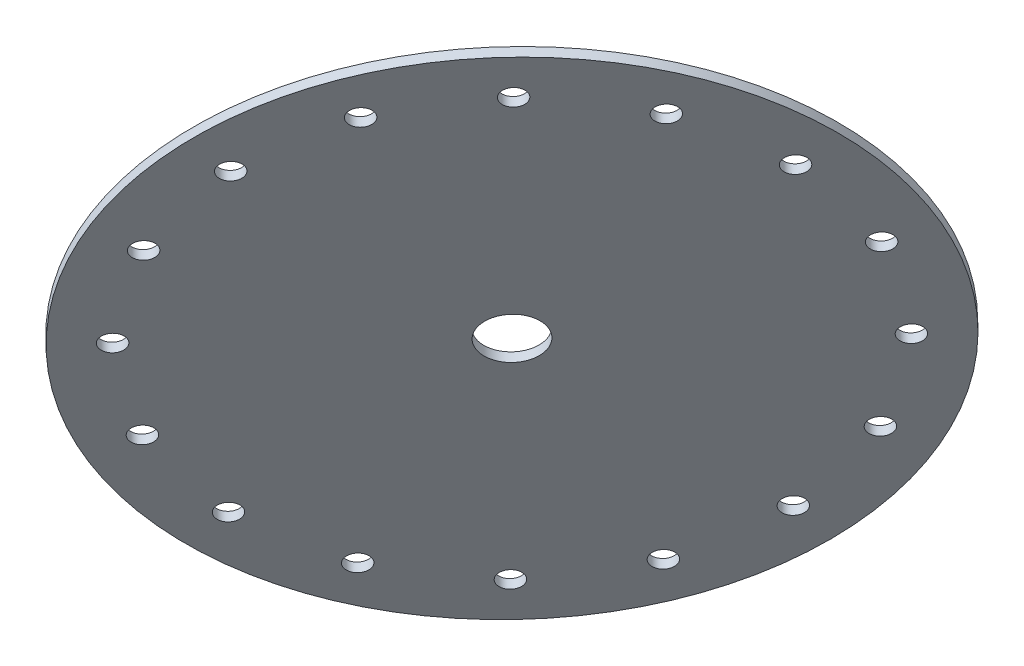
ISO-10303-21;
HEADER;
FILE_DESCRIPTION(('STEP AP214'),'2;1');
FILE_NAME('part.step','',(''),(''),'','','');
FILE_SCHEMA(('AUTOMOTIVE_DESIGN { 1 0 10303 214 1 1 1 1 }'));
ENDSEC;
DATA;
#1=APPLICATION_CONTEXT('core data for automotive mechanical design processes');
#2=APPLICATION_PROTOCOL_DEFINITION('international standard','automotive_design',2000,#1);
#3=PRODUCT_CONTEXT('',#1,'mechanical');
#4=PRODUCT('Part','Part','',(#3));
#5=PRODUCT_RELATED_PRODUCT_CATEGORY('part','',(#4));
#6=PRODUCT_DEFINITION_FORMATION('','',#4);
#7=PRODUCT_DEFINITION_CONTEXT('part definition',#1,'design');
#8=PRODUCT_DEFINITION('design','',#6,#7);
#9=PRODUCT_DEFINITION_SHAPE('','',#8);
#10=(LENGTH_UNIT() NAMED_UNIT(*) SI_UNIT(.MILLI.,.METRE.));
#11=(NAMED_UNIT(*) PLANE_ANGLE_UNIT() SI_UNIT($,.RADIAN.));
#12=(NAMED_UNIT(*) SI_UNIT($,.STERADIAN.) SOLID_ANGLE_UNIT());
#13=UNCERTAINTY_MEASURE_WITH_UNIT(LENGTH_MEASURE(1.E-05),#10,'distance_accuracy_value','');
#14=(GEOMETRIC_REPRESENTATION_CONTEXT(3) GLOBAL_UNCERTAINTY_ASSIGNED_CONTEXT((#13)) GLOBAL_UNIT_ASSIGNED_CONTEXT((#10,
#11,#12)) REPRESENTATION_CONTEXT('',''));
#15=CARTESIAN_POINT('',(0.,0.,0.));
#16=DIRECTION('',(0.,0.,1.));
#17=DIRECTION('',(1.,0.,0.));
#18=AXIS2_PLACEMENT_3D('',#15,#16,#17);
#19=CARTESIAN_POINT('',(-287.529683175413,126.833377096205,-277.095107799131));
#20=DIRECTION('',(0.686266038589698,-0.302721577471584,0.661361150062143));
#21=DIRECTION('',(0.693920573141432,0.,-0.720051552439869));
#22=AXIS2_PLACEMENT_3D('',#19,#20,#21);
#23=PLANE('',#22);
#24=CARTESIAN_POINT('',(-320.056405661196,-16.1282885565635,-308.78066410037));
#25=DIRECTION('',(0.686266038589698,-0.302721577471584,0.661361150062143));
#26=DIRECTION('',(0.693920573141432,0.,-0.720051552439869));
#27=AXIS2_PLACEMENT_3D('',#24,#25,#26);
#28=CIRCLE('',#27,6.09999999999997);
#29=CARTESIAN_POINT('',(-315.823490165033,-16.1282885565635,-313.172978570253));
#30=VERTEX_POINT('',#29);
#31=EDGE_CURVE('E131',#30,#30,#28,.T.);
#32=ORIENTED_EDGE('',*,*,#31,.F.);
#33=EDGE_LOOP('',(#32));
#34=FACE_BOUND('',#33,.T.);
#35=CARTESIAN_POINT('',(-236.890605304079,25.9088358261778,-375.836794850627));
#36=DIRECTION('',(0.686266038589698,-0.302721577471584,0.661361150062143));
#37=DIRECTION('',(0.693920573141432,0.,-0.720051552439869));
#38=AXIS2_PLACEMENT_3D('',#35,#36,#37);
#39=CIRCLE('',#38,6.09999999999995);
#40=CARTESIAN_POINT('',(-232.657689807916,25.9088358261778,-380.22910932051));
#41=VERTEX_POINT('',#40);
#42=EDGE_CURVE('E119',#41,#41,#39,.T.);
#43=ORIENTED_EDGE('',*,*,#42,.F.);
#44=EDGE_LOOP('',(#43));
#45=FACE_BOUND('',#44,.T.);
#46=CARTESIAN_POINT('',(-183.388489977923,127.066187708618,-385.051384497717));
#47=DIRECTION('',(0.686266038589698,-0.302721577471584,0.661361150062143));
#48=DIRECTION('',(0.693920573141432,0.,-0.720051552439869));
#49=AXIS2_PLACEMENT_3D('',#46,#47,#48);
#50=CIRCLE('',#49,6.09999999999999);
#51=CARTESIAN_POINT('',(-179.15557448176,127.066187708618,-389.4436989676));
#52=VERTEX_POINT('',#51);
#53=EDGE_CURVE('E107',#52,#52,#50,.T.);
#54=ORIENTED_EDGE('',*,*,#53,.F.);
#55=EDGE_LOOP('',(#54));
#56=FACE_BOUND('',#55,.T.);
#57=CARTESIAN_POINT('',(-190.890873225139,228.08716229177,-331.026651398078));
#58=DIRECTION('',(0.686266038589698,-0.302721577471584,0.661361150062143));
#59=DIRECTION('',(0.693920573141432,0.,-0.720051552439869));
#60=AXIS2_PLACEMENT_3D('',#57,#58,#59);
#61=CIRCLE('',#60,6.09999999999999);
#62=CARTESIAN_POINT('',(-186.657957728977,228.08716229177,-335.418965867961));
#63=VERTEX_POINT('',#62);
#64=EDGE_CURVE('E95',#63,#63,#61,.T.);
#65=ORIENTED_EDGE('',*,*,#64,.F.);
#66=EDGE_LOOP('',(#65));
#67=FACE_BOUND('',#66,.T.);
#68=CARTESIAN_POINT('',(-255.00296068963,269.795042748973,-245.409551497891));
#69=DIRECTION('',(0.686266038589698,-0.302721577471584,0.661361150062143));
#70=DIRECTION('',(0.693920573141432,0.,-0.720051552439869));
#71=AXIS2_PLACEMENT_3D('',#68,#69,#70);
#72=CIRCLE('',#71,6.09999999999997);
#73=CARTESIAN_POINT('',(-250.770045193467,269.795042748973,-249.801865967774));
#74=VERTEX_POINT('',#73);
#75=EDGE_CURVE('E83',#74,#74,#72,.T.);
#76=ORIENTED_EDGE('',*,*,#75,.F.);
#77=EDGE_LOOP('',(#76));
#78=FACE_BOUND('',#77,.T.);
#79=CARTESIAN_POINT('',(-338.168761046747,227.757918366231,-178.353420747634));
#80=DIRECTION('',(0.686266038589698,-0.302721577471584,0.661361150062143));
#81=DIRECTION('',(0.693920573141432,0.,-0.720051552439869));
#82=AXIS2_PLACEMENT_3D('',#79,#80,#81);
#83=CIRCLE('',#82,6.09999999999999);
#84=CARTESIAN_POINT('',(-333.935845550584,227.757918366231,-182.745735217517));
#85=VERTEX_POINT('',#84);
#86=EDGE_CURVE('E71',#85,#85,#83,.T.);
#87=ORIENTED_EDGE('',*,*,#86,.F.);
#88=EDGE_LOOP('',(#87));
#89=FACE_BOUND('',#88,.T.);
#90=CARTESIAN_POINT('',(-391.670876372903,126.600566483792,-169.138831100544));
#91=DIRECTION('',(0.686266038589698,-0.302721577471584,0.661361150062143));
#92=DIRECTION('',(0.693920573141432,0.,-0.720051552439869));
#93=AXIS2_PLACEMENT_3D('',#90,#91,#92);
#94=CIRCLE('',#93,6.09999999999997);
#95=CARTESIAN_POINT('',(-387.43796087674,126.600566483792,-173.531145570427));
#96=VERTEX_POINT('',#95);
#97=EDGE_CURVE('E59',#96,#96,#94,.T.);
#98=ORIENTED_EDGE('',*,*,#97,.F.);
#99=EDGE_LOOP('',(#98));
#100=FACE_BOUND('',#99,.T.);
#101=CARTESIAN_POINT('',(-384.168493125686,25.5795919006389,-223.163564200183));
#102=DIRECTION('',(0.686266038589698,-0.302721577471584,0.661361150062143));
#103=DIRECTION('',(0.693920573141432,0.,-0.720051552439869));
#104=AXIS2_PLACEMENT_3D('',#101,#102,#103);
#105=CIRCLE('',#104,6.09999999999997);
#106=CARTESIAN_POINT('',(-379.935577629524,25.5795919006389,-227.555878670066));
#107=VERTEX_POINT('',#106);
#108=EDGE_CURVE('E47',#107,#107,#105,.T.);
#109=ORIENTED_EDGE('',*,*,#108,.F.);
#110=EDGE_LOOP('',(#109));
#111=FACE_BOUND('',#110,.T.);
#112=CARTESIAN_POINT('',(-287.529683175413,126.833377096205,-277.095107799131));
#113=DIRECTION('',(0.686266038589698,-0.302721577471584,0.661361150062143));
#114=DIRECTION('',(0.693920573141432,0.,-0.720051552439869));
#115=AXIS2_PLACEMENT_3D('',#112,#113,#114);
#116=CIRCLE('',#115,175.);
#117=CARTESIAN_POINT('',(-166.093582875662,126.833377096205,-403.104129476108));
#118=VERTEX_POINT('',#117);
#119=EDGE_CURVE('E10',#118,#118,#116,.T.);
#120=ORIENTED_EDGE('',*,*,#119,.T.);
#121=EDGE_LOOP('',(#120));
#122=FACE_BOUND('',#121,.T.);
#123=CARTESIAN_POINT('',(-287.529683175413,126.833377096205,-277.095107799131));
#124=DIRECTION('',(0.686266038589698,-0.302721577471584,0.661361150062143));
#125=DIRECTION('',(0.693920573141432,0.,-0.720051552439869));
#126=AXIS2_PLACEMENT_3D('',#123,#124,#125);
#127=CIRCLE('',#126,15.);
#128=CARTESIAN_POINT('',(-277.120874578291,126.833377096205,-287.895881085728));
#129=VERTEX_POINT('',#128);
#130=EDGE_CURVE('E42',#129,#129,#127,.T.);
#131=ORIENTED_EDGE('',*,*,#130,.F.);
#132=EDGE_LOOP('',(#131));
#133=FACE_BOUND('',#132,.T.);
#134=CARTESIAN_POINT('',(-396.191037866324,71.9092272278131,-189.482050792937));
#135=DIRECTION('',(0.686266038589698,-0.302721577471584,0.661361150062143));
#136=DIRECTION('',(0.693920573141432,0.,-0.720051552439869));
#137=AXIS2_PLACEMENT_3D('',#134,#135,#136);
#138=CIRCLE('',#137,6.09999999999997);
#139=CARTESIAN_POINT('',(-391.958122370161,71.9092272278131,-193.87436526282));
#140=VERTEX_POINT('',#139);
#141=EDGE_CURVE('E53',#140,#140,#138,.T.);
#142=ORIENTED_EDGE('',*,*,#141,.F.);
#143=EDGE_LOOP('',(#142));
#144=FACE_BOUND('',#143,.T.);
#145=CARTESIAN_POINT('',(-371.296162257431,181.327349045076,-165.230975909426));
#146=DIRECTION('',(0.686266038589698,-0.302721577471584,0.661361150062143));
#147=DIRECTION('',(0.693920573141432,0.,-0.720051552439869));
#148=AXIS2_PLACEMENT_3D('',#145,#146,#147);
#149=CIRCLE('',#148,6.10000000000001);
#150=CARTESIAN_POINT('',(-367.063246761269,181.327349045076,-169.623290379309));
#151=VERTEX_POINT('',#150);
#152=EDGE_CURVE('E65',#151,#151,#149,.T.);
#153=ORIENTED_EDGE('',*,*,#152,.F.);
#154=EDGE_LOOP('',(#153));
#155=FACE_BOUND('',#154,.T.);
#156=CARTESIAN_POINT('',(-297.332019274535,258.82364116227,-206.508392343811));
#157=DIRECTION('',(0.686266038589698,-0.302721577471584,0.661361150062143));
#158=DIRECTION('',(0.693920573141432,0.,-0.720051552439869));
#159=AXIS2_PLACEMENT_3D('',#156,#157,#158);
#160=CIRCLE('',#159,6.09999999999997);
#161=CARTESIAN_POINT('',(-293.099103778372,258.82364116227,-210.900706813694));
#162=VERTEX_POINT('',#161);
#163=EDGE_CURVE('E77',#162,#162,#160,.T.);
#164=ORIENTED_EDGE('',*,*,#163,.F.);
#165=EDGE_LOOP('',(#164));
#166=FACE_BOUND('',#165,.T.);
#167=CARTESIAN_POINT('',(-217.625800747712,259.001826690768,-289.134549368552));
#168=DIRECTION('',(0.686266038589698,-0.302721577471584,0.661361150062143));
#169=DIRECTION('',(0.693920573141432,0.,-0.720051552439869));
#170=AXIS2_PLACEMENT_3D('',#167,#168,#169);
#171=CIRCLE('',#170,6.09999999999999);
#172=CARTESIAN_POINT('',(-213.392885251549,259.001826690768,-293.526863838435));
#173=VERTEX_POINT('',#172);
#174=EDGE_CURVE('E89',#173,#173,#171,.T.);
#175=ORIENTED_EDGE('',*,*,#174,.F.);
#176=EDGE_LOOP('',(#175));
#177=FACE_BOUND('',#176,.T.);
#178=CARTESIAN_POINT('',(-178.868328484502,181.757526964596,-364.708164805324));
#179=DIRECTION('',(0.686266038589698,-0.302721577471584,0.661361150062143));
#180=DIRECTION('',(0.693920573141432,0.,-0.720051552439869));
#181=AXIS2_PLACEMENT_3D('',#178,#179,#180);
#182=CIRCLE('',#181,6.09999999999997);
#183=CARTESIAN_POINT('',(-174.635412988339,181.757526964596,-369.100479275207));
#184=VERTEX_POINT('',#183);
#185=EDGE_CURVE('E101',#184,#184,#182,.T.);
#186=ORIENTED_EDGE('',*,*,#185,.F.);
#187=EDGE_LOOP('',(#186));
#188=FACE_BOUND('',#187,.T.);
#189=CARTESIAN_POINT('',(-203.763204093394,72.3394051473329,-388.959239688835));
#190=DIRECTION('',(0.686266038589698,-0.302721577471584,0.661361150062143));
#191=DIRECTION('',(0.693920573141432,0.,-0.720051552439869));
#192=AXIS2_PLACEMENT_3D('',#189,#190,#191);
#193=CIRCLE('',#192,6.09999999999999);
#194=CARTESIAN_POINT('',(-199.530288597231,72.3394051473329,-393.351554158719));
#195=VERTEX_POINT('',#194);
#196=EDGE_CURVE('E113',#195,#195,#193,.T.);
#197=ORIENTED_EDGE('',*,*,#196,.F.);
#198=EDGE_LOOP('',(#197));
#199=FACE_BOUND('',#198,.T.);
#200=CARTESIAN_POINT('',(-277.727347076291,-5.15688696986042,-347.68182325445));
#201=DIRECTION('',(0.686266038589698,-0.302721577471584,0.661361150062143));
#202=DIRECTION('',(0.693920573141432,0.,-0.720051552439869));
#203=AXIS2_PLACEMENT_3D('',#200,#201,#202);
#204=CIRCLE('',#203,6.09999999999997);
#205=CARTESIAN_POINT('',(-273.494431580128,-5.15688696986042,-352.074137724333));
#206=VERTEX_POINT('',#205);
#207=EDGE_CURVE('E125',#206,#206,#204,.T.);
#208=ORIENTED_EDGE('',*,*,#207,.F.);
#209=EDGE_LOOP('',(#208));
#210=FACE_BOUND('',#209,.T.);
#211=CARTESIAN_POINT('',(-357.433565603114,-5.33507249835891,-265.055666229709));
#212=DIRECTION('',(0.686266038589698,-0.302721577471584,0.661361150062143));
#213=DIRECTION('',(0.693920573141432,0.,-0.720051552439869));
#214=AXIS2_PLACEMENT_3D('',#211,#212,#213);
#215=CIRCLE('',#214,6.10000000000001);
#216=CARTESIAN_POINT('',(-353.200650106951,-5.33507249835891,-269.447980699592));
#217=VERTEX_POINT('',#216);
#218=EDGE_CURVE('E137',#217,#217,#215,.T.);
#219=ORIENTED_EDGE('',*,*,#218,.F.);
#220=EDGE_LOOP('',(#219));
#221=FACE_BOUND('',#220,.T.);
#222=ADVANCED_FACE('F31',(#34,#45,#56,#67,#78,#89,#100,#111,#122,#133,#144,#155,#166,#177,#188,
#199,#210,#221),#23,.T.);
#223=CARTESIAN_POINT('',(-290.961013368361,128.346984983563,-280.401913549441));
#224=DIRECTION('',(0.686266038589698,-0.302721577471584,0.661361150062143));
#225=DIRECTION('',(0.693920573141432,0.,-0.720051552439869));
#226=AXIS2_PLACEMENT_3D('',#223,#224,#225);
#227=PLANE('',#226);
#228=CARTESIAN_POINT('',(-290.961013368361,128.346984983563,-280.401913549441));
#229=DIRECTION('',(0.686266038589698,-0.302721577471584,0.661361150062143));
#230=DIRECTION('',(0.693920573141432,0.,-0.720051552439869));
#231=AXIS2_PLACEMENT_3D('',#228,#229,#230);
#232=CIRCLE('',#231,175.);
#233=CARTESIAN_POINT('',(-169.524913068611,128.346984983563,-406.410935226418));
#234=VERTEX_POINT('',#233);
#235=EDGE_CURVE('E35',#234,#234,#232,.T.);
#236=ORIENTED_EDGE('',*,*,#235,.F.);
#237=EDGE_LOOP('',(#236));
#238=FACE_BOUND('',#237,.T.);
#239=CARTESIAN_POINT('',(-290.961013368361,128.346984983563,-280.401913549441));
#240=DIRECTION('',(0.686266038589698,-0.302721577471584,0.661361150062143));
#241=DIRECTION('',(0.693920573141432,0.,-0.720051552439869));
#242=AXIS2_PLACEMENT_3D('',#239,#240,#241);
#243=CIRCLE('',#242,15.);
#244=CARTESIAN_POINT('',(-280.55220477124,128.346984983563,-291.202686836039));
#245=VERTEX_POINT('',#244);
#246=EDGE_CURVE('E44',#245,#245,#243,.T.);
#247=ORIENTED_EDGE('',*,*,#246,.T.);
#248=EDGE_LOOP('',(#247));
#249=FACE_BOUND('',#248,.T.);
#250=CARTESIAN_POINT('',(-387.599823318635,27.0931997879968,-226.470369950494));
#251=DIRECTION('',(0.686266038589698,-0.302721577471584,0.661361150062143));
#252=DIRECTION('',(0.693920573141432,0.,-0.720051552439869));
#253=AXIS2_PLACEMENT_3D('',#250,#251,#252);
#254=CIRCLE('',#253,6.09999999999997);
#255=CARTESIAN_POINT('',(-383.366907822472,27.0931997879968,-230.862684420377));
#256=VERTEX_POINT('',#255);
#257=EDGE_CURVE('E50',#256,#256,#254,.T.);
#258=ORIENTED_EDGE('',*,*,#257,.T.);
#259=EDGE_LOOP('',(#258));
#260=FACE_BOUND('',#259,.T.);
#261=CARTESIAN_POINT('',(-399.622368059272,73.4228351151711,-192.788856543248));
#262=DIRECTION('',(0.686266038589698,-0.302721577471584,0.661361150062143));
#263=DIRECTION('',(0.693920573141432,0.,-0.720051552439869));
#264=AXIS2_PLACEMENT_3D('',#261,#262,#263);
#265=CIRCLE('',#264,6.09999999999997);
#266=CARTESIAN_POINT('',(-395.389452563109,73.4228351151711,-197.181171013131));
#267=VERTEX_POINT('',#266);
#268=EDGE_CURVE('E56',#267,#267,#265,.T.);
#269=ORIENTED_EDGE('',*,*,#268,.T.);
#270=EDGE_LOOP('',(#269));
#271=FACE_BOUND('',#270,.T.);
#272=CARTESIAN_POINT('',(-395.102206565851,128.11417437115,-172.445636850855));
#273=DIRECTION('',(0.686266038589698,-0.302721577471584,0.661361150062143));
#274=DIRECTION('',(0.693920573141432,0.,-0.720051552439869));
#275=AXIS2_PLACEMENT_3D('',#272,#273,#274);
#276=CIRCLE('',#275,6.09999999999997);
#277=CARTESIAN_POINT('',(-390.869291069689,128.11417437115,-176.837951320738));
#278=VERTEX_POINT('',#277);
#279=EDGE_CURVE('E62',#278,#278,#276,.T.);
#280=ORIENTED_EDGE('',*,*,#279,.T.);
#281=EDGE_LOOP('',(#280));
#282=FACE_BOUND('',#281,.T.);
#283=CARTESIAN_POINT('',(-374.72749245038,182.840956932434,-168.537781659736));
#284=DIRECTION('',(0.686266038589698,-0.302721577471584,0.661361150062143));
#285=DIRECTION('',(0.693920573141432,0.,-0.720051552439869));
#286=AXIS2_PLACEMENT_3D('',#283,#284,#285);
#287=CIRCLE('',#286,6.10000000000001);
#288=CARTESIAN_POINT('',(-370.494576954217,182.840956932434,-172.93009612962));
#289=VERTEX_POINT('',#288);
#290=EDGE_CURVE('E68',#289,#289,#287,.T.);
#291=ORIENTED_EDGE('',*,*,#290,.T.);
#292=EDGE_LOOP('',(#291));
#293=FACE_BOUND('',#292,.T.);
#294=CARTESIAN_POINT('',(-341.600091239695,229.271526253589,-181.660226497945));
#295=DIRECTION('',(0.686266038589698,-0.302721577471584,0.661361150062143));
#296=DIRECTION('',(0.693920573141432,0.,-0.720051552439869));
#297=AXIS2_PLACEMENT_3D('',#294,#295,#296);
#298=CIRCLE('',#297,6.09999999999999);
#299=CARTESIAN_POINT('',(-337.367175743532,229.271526253589,-186.052540967828));
#300=VERTEX_POINT('',#299);
#301=EDGE_CURVE('E74',#300,#300,#298,.T.);
#302=ORIENTED_EDGE('',*,*,#301,.T.);
#303=EDGE_LOOP('',(#302));
#304=FACE_BOUND('',#303,.T.);
#305=CARTESIAN_POINT('',(-300.763349467483,260.337249049628,-209.815198094122));
#306=DIRECTION('',(0.686266038589698,-0.302721577471584,0.661361150062143));
#307=DIRECTION('',(0.693920573141432,0.,-0.720051552439869));
#308=AXIS2_PLACEMENT_3D('',#305,#306,#307);
#309=CIRCLE('',#308,6.09999999999997);
#310=CARTESIAN_POINT('',(-296.530433971321,260.337249049628,-214.207512564005));
#311=VERTEX_POINT('',#310);
#312=EDGE_CURVE('E80',#311,#311,#309,.T.);
#313=ORIENTED_EDGE('',*,*,#312,.T.);
#314=EDGE_LOOP('',(#313));
#315=FACE_BOUND('',#314,.T.);
#316=CARTESIAN_POINT('',(-258.434290882579,271.308650636331,-248.716357248202));
#317=DIRECTION('',(0.686266038589698,-0.302721577471584,0.661361150062143));
#318=DIRECTION('',(0.693920573141432,0.,-0.720051552439869));
#319=AXIS2_PLACEMENT_3D('',#316,#317,#318);
#320=CIRCLE('',#319,6.09999999999997);
#321=CARTESIAN_POINT('',(-254.201375386416,271.308650636331,-253.108671718085));
#322=VERTEX_POINT('',#321);
#323=EDGE_CURVE('E86',#322,#322,#320,.T.);
#324=ORIENTED_EDGE('',*,*,#323,.T.);
#325=EDGE_LOOP('',(#324));
#326=FACE_BOUND('',#325,.T.);
#327=CARTESIAN_POINT('',(-221.057130940661,260.515434578126,-292.441355118862));
#328=DIRECTION('',(0.686266038589698,-0.302721577471584,0.661361150062143));
#329=DIRECTION('',(0.693920573141432,0.,-0.720051552439869));
#330=AXIS2_PLACEMENT_3D('',#327,#328,#329);
#331=CIRCLE('',#330,6.09999999999999);
#332=CARTESIAN_POINT('',(-216.824215444498,260.515434578126,-296.833669588746));
#333=VERTEX_POINT('',#332);
#334=EDGE_CURVE('E92',#333,#333,#331,.T.);
#335=ORIENTED_EDGE('',*,*,#334,.T.);
#336=EDGE_LOOP('',(#335));
#337=FACE_BOUND('',#336,.T.);
#338=CARTESIAN_POINT('',(-194.322203418088,229.600770179128,-334.333457148388));
#339=DIRECTION('',(0.686266038589698,-0.302721577471584,0.661361150062143));
#340=DIRECTION('',(0.693920573141432,0.,-0.720051552439869));
#341=AXIS2_PLACEMENT_3D('',#338,#339,#340);
#342=CIRCLE('',#341,6.09999999999999);
#343=CARTESIAN_POINT('',(-190.089287921925,229.600770179128,-338.725771618272));
#344=VERTEX_POINT('',#343);
#345=EDGE_CURVE('E98',#344,#344,#342,.T.);
#346=ORIENTED_EDGE('',*,*,#345,.T.);
#347=EDGE_LOOP('',(#346));
#348=FACE_BOUND('',#347,.T.);
#349=CARTESIAN_POINT('',(-182.29965867745,183.271134851954,-368.014970555635));
#350=DIRECTION('',(0.686266038589698,-0.302721577471584,0.661361150062143));
#351=DIRECTION('',(0.693920573141432,0.,-0.720051552439869));
#352=AXIS2_PLACEMENT_3D('',#349,#350,#351);
#353=CIRCLE('',#352,6.09999999999997);
#354=CARTESIAN_POINT('',(-178.066743181288,183.271134851954,-372.407285025518));
#355=VERTEX_POINT('',#354);
#356=EDGE_CURVE('E104',#355,#355,#353,.T.);
#357=ORIENTED_EDGE('',*,*,#356,.T.);
#358=EDGE_LOOP('',(#357));
#359=FACE_BOUND('',#358,.T.);
#360=CARTESIAN_POINT('',(-186.819820170871,128.579795595976,-388.358190248028));
#361=DIRECTION('',(0.686266038589698,-0.302721577471584,0.661361150062143));
#362=DIRECTION('',(0.693920573141432,0.,-0.720051552439869));
#363=AXIS2_PLACEMENT_3D('',#360,#361,#362);
#364=CIRCLE('',#363,6.09999999999999);
#365=CARTESIAN_POINT('',(-182.586904674708,128.579795595976,-392.750504717911));
#366=VERTEX_POINT('',#365);
#367=EDGE_CURVE('E110',#366,#366,#364,.T.);
#368=ORIENTED_EDGE('',*,*,#367,.T.);
#369=EDGE_LOOP('',(#368));
#370=FACE_BOUND('',#369,.T.);
#371=CARTESIAN_POINT('',(-207.194534286343,73.8530130346908,-392.266045439146));
#372=DIRECTION('',(0.686266038589698,-0.302721577471584,0.661361150062143));
#373=DIRECTION('',(0.693920573141432,0.,-0.720051552439869));
#374=AXIS2_PLACEMENT_3D('',#371,#372,#373);
#375=CIRCLE('',#374,6.09999999999999);
#376=CARTESIAN_POINT('',(-202.96161879018,73.8530130346908,-396.658359909029));
#377=VERTEX_POINT('',#376);
#378=EDGE_CURVE('E116',#377,#377,#375,.T.);
#379=ORIENTED_EDGE('',*,*,#378,.T.);
#380=EDGE_LOOP('',(#379));
#381=FACE_BOUND('',#380,.T.);
#382=CARTESIAN_POINT('',(-240.321935497028,27.4224437135357,-379.143600600938));
#383=DIRECTION('',(0.686266038589698,-0.302721577471584,0.661361150062143));
#384=DIRECTION('',(0.693920573141432,0.,-0.720051552439869));
#385=AXIS2_PLACEMENT_3D('',#382,#383,#384);
#386=CIRCLE('',#385,6.09999999999995);
#387=CARTESIAN_POINT('',(-236.089020000865,27.4224437135357,-383.535915070821));
#388=VERTEX_POINT('',#387);
#389=EDGE_CURVE('E122',#388,#388,#386,.T.);
#390=ORIENTED_EDGE('',*,*,#389,.T.);
#391=EDGE_LOOP('',(#390));
#392=FACE_BOUND('',#391,.T.);
#393=CARTESIAN_POINT('',(-281.158677269239,-3.6432790825025,-350.988629004761));
#394=DIRECTION('',(0.686266038589698,-0.302721577471584,0.661361150062143));
#395=DIRECTION('',(0.693920573141432,0.,-0.720051552439869));
#396=AXIS2_PLACEMENT_3D('',#393,#394,#395);
#397=CIRCLE('',#396,6.09999999999997);
#398=CARTESIAN_POINT('',(-276.925761773076,-3.6432790825025,-355.380943474644));
#399=VERTEX_POINT('',#398);
#400=EDGE_CURVE('E128',#399,#399,#397,.T.);
#401=ORIENTED_EDGE('',*,*,#400,.T.);
#402=EDGE_LOOP('',(#401));
#403=FACE_BOUND('',#402,.T.);
#404=CARTESIAN_POINT('',(-323.487735854144,-14.6146806692056,-312.087469850681));
#405=DIRECTION('',(0.686266038589698,-0.302721577471584,0.661361150062143));
#406=DIRECTION('',(0.693920573141432,0.,-0.720051552439869));
#407=AXIS2_PLACEMENT_3D('',#404,#405,#406);
#408=CIRCLE('',#407,6.09999999999997);
#409=CARTESIAN_POINT('',(-319.254820357981,-14.6146806692056,-316.479784320564));
#410=VERTEX_POINT('',#409);
#411=EDGE_CURVE('E134',#410,#410,#408,.T.);
#412=ORIENTED_EDGE('',*,*,#411,.T.);
#413=EDGE_LOOP('',(#412));
#414=FACE_BOUND('',#413,.T.);
#415=CARTESIAN_POINT('',(-360.864895796062,-3.821464611001,-268.36247198002));
#416=DIRECTION('',(0.686266038589698,-0.302721577471584,0.661361150062143));
#417=DIRECTION('',(0.693920573141432,0.,-0.720051552439869));
#418=AXIS2_PLACEMENT_3D('',#415,#416,#417);
#419=CIRCLE('',#418,6.10000000000001);
#420=CARTESIAN_POINT('',(-356.631980299899,-3.821464611001,-272.754786449903));
#421=VERTEX_POINT('',#420);
#422=EDGE_CURVE('E140',#421,#421,#419,.T.);
#423=ORIENTED_EDGE('',*,*,#422,.T.);
#424=EDGE_LOOP('',(#423));
#425=FACE_BOUND('',#424,.T.);
#426=ADVANCED_FACE('F150',(#238,#249,#260,#271,#282,#293,#304,#315,#326,#337,#348,#359,#370,
#381,#392,#403,#414,#425),#227,.F.);
#427=CARTESIAN_POINT('',(-287.529683175413,126.833377096205,-277.095107799131));
#428=DIRECTION('',(-0.686266038589698,0.302721577471584,-0.661361150062143));
#429=DIRECTION('',(-0.693920573141432,0.,0.720051552439869));
#430=AXIS2_PLACEMENT_3D('',#427,#428,#429);
#431=CYLINDRICAL_SURFACE('',#430,175.);
#432=ORIENTED_EDGE('',*,*,#119,.F.);
#433=EDGE_LOOP('',(#432));
#434=FACE_BOUND('',#433,.T.);
#435=ORIENTED_EDGE('',*,*,#235,.T.);
#436=EDGE_LOOP('',(#435));
#437=FACE_BOUND('',#436,.T.);
#438=ADVANCED_FACE('F33',(#434,#437),#431,.T.);
#439=CARTESIAN_POINT('',(-287.529683175413,126.833377096205,-277.095107799131));
#440=DIRECTION('',(-0.686266038589698,0.302721577471584,-0.661361150062143));
#441=DIRECTION('',(-0.693920573141432,0.,0.720051552439869));
#442=AXIS2_PLACEMENT_3D('',#439,#440,#441);
#443=CYLINDRICAL_SURFACE('',#442,15.);
#444=ORIENTED_EDGE('',*,*,#130,.T.);
#445=EDGE_LOOP('',(#444));
#446=FACE_BOUND('',#445,.T.);
#447=ORIENTED_EDGE('',*,*,#246,.F.);
#448=EDGE_LOOP('',(#447));
#449=FACE_BOUND('',#448,.T.);
#450=ADVANCED_FACE('F160',(#446,#449),#443,.F.);
#451=CARTESIAN_POINT('',(-384.168493125686,25.5795919006389,-223.163564200183));
#452=DIRECTION('',(-0.686266038589698,0.302721577471584,-0.661361150062143));
#453=DIRECTION('',(-0.693920573141432,0.,0.720051552439869));
#454=AXIS2_PLACEMENT_3D('',#451,#452,#453);
#455=CYLINDRICAL_SURFACE('',#454,6.09999999999997);
#456=ORIENTED_EDGE('',*,*,#108,.T.);
#457=EDGE_LOOP('',(#456));
#458=FACE_BOUND('',#457,.T.);
#459=ORIENTED_EDGE('',*,*,#257,.F.);
#460=EDGE_LOOP('',(#459));
#461=FACE_BOUND('',#460,.T.);
#462=ADVANCED_FACE('F163',(#458,#461),#455,.F.);
#463=CARTESIAN_POINT('',(-396.191037866324,71.9092272278131,-189.482050792937));
#464=DIRECTION('',(-0.686266038589698,0.302721577471584,-0.661361150062143));
#465=DIRECTION('',(-0.693920573141432,0.,0.720051552439869));
#466=AXIS2_PLACEMENT_3D('',#463,#464,#465);
#467=CYLINDRICAL_SURFACE('',#466,6.09999999999997);
#468=ORIENTED_EDGE('',*,*,#141,.T.);
#469=EDGE_LOOP('',(#468));
#470=FACE_BOUND('',#469,.T.);
#471=ORIENTED_EDGE('',*,*,#268,.F.);
#472=EDGE_LOOP('',(#471));
#473=FACE_BOUND('',#472,.T.);
#474=ADVANCED_FACE('F167',(#470,#473),#467,.F.);
#475=CARTESIAN_POINT('',(-391.670876372903,126.600566483792,-169.138831100544));
#476=DIRECTION('',(-0.686266038589698,0.302721577471584,-0.661361150062143));
#477=DIRECTION('',(-0.693920573141432,0.,0.720051552439869));
#478=AXIS2_PLACEMENT_3D('',#475,#476,#477);
#479=CYLINDRICAL_SURFACE('',#478,6.09999999999997);
#480=ORIENTED_EDGE('',*,*,#97,.T.);
#481=EDGE_LOOP('',(#480));
#482=FACE_BOUND('',#481,.T.);
#483=ORIENTED_EDGE('',*,*,#279,.F.);
#484=EDGE_LOOP('',(#483));
#485=FACE_BOUND('',#484,.T.);
#486=ADVANCED_FACE('F171',(#482,#485),#479,.F.);
#487=CARTESIAN_POINT('',(-371.296162257431,181.327349045076,-165.230975909426));
#488=DIRECTION('',(-0.686266038589698,0.302721577471584,-0.661361150062143));
#489=DIRECTION('',(-0.693920573141432,0.,0.720051552439869));
#490=AXIS2_PLACEMENT_3D('',#487,#488,#489);
#491=CYLINDRICAL_SURFACE('',#490,6.10000000000001);
#492=ORIENTED_EDGE('',*,*,#152,.T.);
#493=EDGE_LOOP('',(#492));
#494=FACE_BOUND('',#493,.T.);
#495=ORIENTED_EDGE('',*,*,#290,.F.);
#496=EDGE_LOOP('',(#495));
#497=FACE_BOUND('',#496,.T.);
#498=ADVANCED_FACE('F175',(#494,#497),#491,.F.);
#499=CARTESIAN_POINT('',(-338.168761046747,227.757918366231,-178.353420747634));
#500=DIRECTION('',(-0.686266038589698,0.302721577471584,-0.661361150062143));
#501=DIRECTION('',(-0.693920573141432,0.,0.720051552439869));
#502=AXIS2_PLACEMENT_3D('',#499,#500,#501);
#503=CYLINDRICAL_SURFACE('',#502,6.09999999999999);
#504=ORIENTED_EDGE('',*,*,#86,.T.);
#505=EDGE_LOOP('',(#504));
#506=FACE_BOUND('',#505,.T.);
#507=ORIENTED_EDGE('',*,*,#301,.F.);
#508=EDGE_LOOP('',(#507));
#509=FACE_BOUND('',#508,.T.);
#510=ADVANCED_FACE('F179',(#506,#509),#503,.F.);
#511=CARTESIAN_POINT('',(-297.332019274535,258.82364116227,-206.508392343811));
#512=DIRECTION('',(-0.686266038589698,0.302721577471584,-0.661361150062143));
#513=DIRECTION('',(-0.693920573141432,0.,0.720051552439869));
#514=AXIS2_PLACEMENT_3D('',#511,#512,#513);
#515=CYLINDRICAL_SURFACE('',#514,6.09999999999997);
#516=ORIENTED_EDGE('',*,*,#163,.T.);
#517=EDGE_LOOP('',(#516));
#518=FACE_BOUND('',#517,.T.);
#519=ORIENTED_EDGE('',*,*,#312,.F.);
#520=EDGE_LOOP('',(#519));
#521=FACE_BOUND('',#520,.T.);
#522=ADVANCED_FACE('F183',(#518,#521),#515,.F.);
#523=CARTESIAN_POINT('',(-255.00296068963,269.795042748973,-245.409551497891));
#524=DIRECTION('',(-0.686266038589698,0.302721577471584,-0.661361150062143));
#525=DIRECTION('',(-0.693920573141432,0.,0.720051552439869));
#526=AXIS2_PLACEMENT_3D('',#523,#524,#525);
#527=CYLINDRICAL_SURFACE('',#526,6.09999999999997);
#528=ORIENTED_EDGE('',*,*,#75,.T.);
#529=EDGE_LOOP('',(#528));
#530=FACE_BOUND('',#529,.T.);
#531=ORIENTED_EDGE('',*,*,#323,.F.);
#532=EDGE_LOOP('',(#531));
#533=FACE_BOUND('',#532,.T.);
#534=ADVANCED_FACE('F187',(#530,#533),#527,.F.);
#535=CARTESIAN_POINT('',(-217.625800747712,259.001826690768,-289.134549368552));
#536=DIRECTION('',(-0.686266038589698,0.302721577471584,-0.661361150062143));
#537=DIRECTION('',(-0.693920573141432,0.,0.720051552439869));
#538=AXIS2_PLACEMENT_3D('',#535,#536,#537);
#539=CYLINDRICAL_SURFACE('',#538,6.09999999999999);
#540=ORIENTED_EDGE('',*,*,#174,.T.);
#541=EDGE_LOOP('',(#540));
#542=FACE_BOUND('',#541,.T.);
#543=ORIENTED_EDGE('',*,*,#334,.F.);
#544=EDGE_LOOP('',(#543));
#545=FACE_BOUND('',#544,.T.);
#546=ADVANCED_FACE('F191',(#542,#545),#539,.F.);
#547=CARTESIAN_POINT('',(-190.890873225139,228.08716229177,-331.026651398078));
#548=DIRECTION('',(-0.686266038589698,0.302721577471584,-0.661361150062143));
#549=DIRECTION('',(-0.693920573141432,0.,0.720051552439869));
#550=AXIS2_PLACEMENT_3D('',#547,#548,#549);
#551=CYLINDRICAL_SURFACE('',#550,6.09999999999999);
#552=ORIENTED_EDGE('',*,*,#64,.T.);
#553=EDGE_LOOP('',(#552));
#554=FACE_BOUND('',#553,.T.);
#555=ORIENTED_EDGE('',*,*,#345,.F.);
#556=EDGE_LOOP('',(#555));
#557=FACE_BOUND('',#556,.T.);
#558=ADVANCED_FACE('F195',(#554,#557),#551,.F.);
#559=CARTESIAN_POINT('',(-178.868328484502,181.757526964596,-364.708164805324));
#560=DIRECTION('',(-0.686266038589698,0.302721577471584,-0.661361150062143));
#561=DIRECTION('',(-0.693920573141432,0.,0.720051552439869));
#562=AXIS2_PLACEMENT_3D('',#559,#560,#561);
#563=CYLINDRICAL_SURFACE('',#562,6.09999999999997);
#564=ORIENTED_EDGE('',*,*,#185,.T.);
#565=EDGE_LOOP('',(#564));
#566=FACE_BOUND('',#565,.T.);
#567=ORIENTED_EDGE('',*,*,#356,.F.);
#568=EDGE_LOOP('',(#567));
#569=FACE_BOUND('',#568,.T.);
#570=ADVANCED_FACE('F199',(#566,#569),#563,.F.);
#571=CARTESIAN_POINT('',(-183.388489977923,127.066187708618,-385.051384497717));
#572=DIRECTION('',(-0.686266038589698,0.302721577471584,-0.661361150062143));
#573=DIRECTION('',(-0.693920573141432,0.,0.720051552439869));
#574=AXIS2_PLACEMENT_3D('',#571,#572,#573);
#575=CYLINDRICAL_SURFACE('',#574,6.09999999999999);
#576=ORIENTED_EDGE('',*,*,#53,.T.);
#577=EDGE_LOOP('',(#576));
#578=FACE_BOUND('',#577,.T.);
#579=ORIENTED_EDGE('',*,*,#367,.F.);
#580=EDGE_LOOP('',(#579));
#581=FACE_BOUND('',#580,.T.);
#582=ADVANCED_FACE('F203',(#578,#581),#575,.F.);
#583=CARTESIAN_POINT('',(-203.763204093394,72.3394051473329,-388.959239688835));
#584=DIRECTION('',(-0.686266038589698,0.302721577471584,-0.661361150062143));
#585=DIRECTION('',(-0.693920573141432,0.,0.720051552439869));
#586=AXIS2_PLACEMENT_3D('',#583,#584,#585);
#587=CYLINDRICAL_SURFACE('',#586,6.09999999999999);
#588=ORIENTED_EDGE('',*,*,#196,.T.);
#589=EDGE_LOOP('',(#588));
#590=FACE_BOUND('',#589,.T.);
#591=ORIENTED_EDGE('',*,*,#378,.F.);
#592=EDGE_LOOP('',(#591));
#593=FACE_BOUND('',#592,.T.);
#594=ADVANCED_FACE('F207',(#590,#593),#587,.F.);
#595=CARTESIAN_POINT('',(-236.890605304079,25.9088358261778,-375.836794850627));
#596=DIRECTION('',(-0.686266038589698,0.302721577471584,-0.661361150062143));
#597=DIRECTION('',(-0.693920573141432,0.,0.720051552439869));
#598=AXIS2_PLACEMENT_3D('',#595,#596,#597);
#599=CYLINDRICAL_SURFACE('',#598,6.09999999999995);
#600=ORIENTED_EDGE('',*,*,#42,.T.);
#601=EDGE_LOOP('',(#600));
#602=FACE_BOUND('',#601,.T.);
#603=ORIENTED_EDGE('',*,*,#389,.F.);
#604=EDGE_LOOP('',(#603));
#605=FACE_BOUND('',#604,.T.);
#606=ADVANCED_FACE('F211',(#602,#605),#599,.F.);
#607=CARTESIAN_POINT('',(-277.727347076291,-5.15688696986042,-347.68182325445));
#608=DIRECTION('',(-0.686266038589698,0.302721577471584,-0.661361150062143));
#609=DIRECTION('',(-0.693920573141432,0.,0.720051552439869));
#610=AXIS2_PLACEMENT_3D('',#607,#608,#609);
#611=CYLINDRICAL_SURFACE('',#610,6.09999999999997);
#612=ORIENTED_EDGE('',*,*,#207,.T.);
#613=EDGE_LOOP('',(#612));
#614=FACE_BOUND('',#613,.T.);
#615=ORIENTED_EDGE('',*,*,#400,.F.);
#616=EDGE_LOOP('',(#615));
#617=FACE_BOUND('',#616,.T.);
#618=ADVANCED_FACE('F215',(#614,#617),#611,.F.);
#619=CARTESIAN_POINT('',(-320.056405661196,-16.1282885565635,-308.78066410037));
#620=DIRECTION('',(-0.686266038589698,0.302721577471584,-0.661361150062143));
#621=DIRECTION('',(-0.693920573141432,0.,0.720051552439869));
#622=AXIS2_PLACEMENT_3D('',#619,#620,#621);
#623=CYLINDRICAL_SURFACE('',#622,6.09999999999997);
#624=ORIENTED_EDGE('',*,*,#31,.T.);
#625=EDGE_LOOP('',(#624));
#626=FACE_BOUND('',#625,.T.);
#627=ORIENTED_EDGE('',*,*,#411,.F.);
#628=EDGE_LOOP('',(#627));
#629=FACE_BOUND('',#628,.T.);
#630=ADVANCED_FACE('F219',(#626,#629),#623,.F.);
#631=CARTESIAN_POINT('',(-357.433565603114,-5.33507249835891,-265.055666229709));
#632=DIRECTION('',(-0.686266038589698,0.302721577471584,-0.661361150062143));
#633=DIRECTION('',(-0.693920573141432,0.,0.720051552439869));
#634=AXIS2_PLACEMENT_3D('',#631,#632,#633);
#635=CYLINDRICAL_SURFACE('',#634,6.10000000000001);
#636=ORIENTED_EDGE('',*,*,#218,.T.);
#637=EDGE_LOOP('',(#636));
#638=FACE_BOUND('',#637,.T.);
#639=ORIENTED_EDGE('',*,*,#422,.F.);
#640=EDGE_LOOP('',(#639));
#641=FACE_BOUND('',#640,.T.);
#642=ADVANCED_FACE('F146',(#638,#641),#635,.F.);
#643=CLOSED_SHELL('',(#222,#426,#438,#450,#462,#474,#486,#498,#510,#522,#534,#546,#558,#570,
#582,#594,#606,#618,#630,#642));
#644=MANIFOLD_SOLID_BREP('B2',#643);
#645=ADVANCED_BREP_SHAPE_REPRESENTATION('',(#18,#644),#14);
#646=SHAPE_DEFINITION_REPRESENTATION(#9,#645);
ENDSEC;
END-ISO-10303-21;
